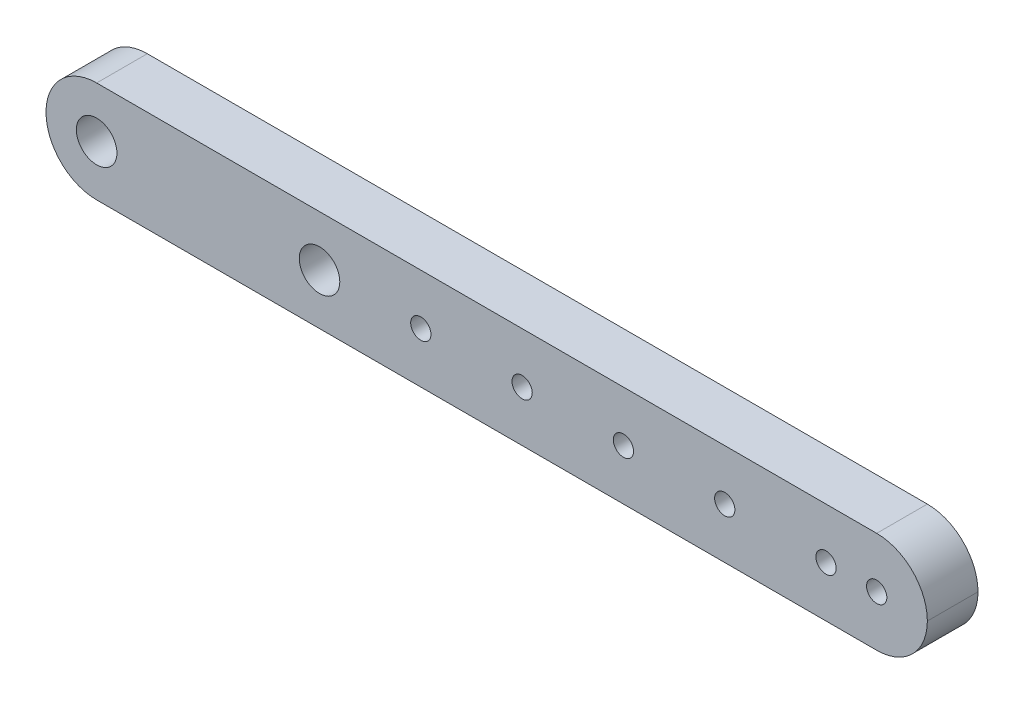
ISO-10303-21;
HEADER;
FILE_DESCRIPTION(('STEP AP214'),'2;1');
FILE_NAME('part.step','',(''),(''),'','','');
FILE_SCHEMA(('AUTOMOTIVE_DESIGN { 1 0 10303 214 1 1 1 1 }'));
ENDSEC;
DATA;
#1=APPLICATION_CONTEXT('core data for automotive mechanical design processes');
#2=APPLICATION_PROTOCOL_DEFINITION('international standard','automotive_design',2000,#1);
#3=PRODUCT_CONTEXT('',#1,'mechanical');
#4=PRODUCT('Part','Part','',(#3));
#5=PRODUCT_RELATED_PRODUCT_CATEGORY('part','',(#4));
#6=PRODUCT_DEFINITION_FORMATION('','',#4);
#7=PRODUCT_DEFINITION_CONTEXT('part definition',#1,'design');
#8=PRODUCT_DEFINITION('design','',#6,#7);
#9=PRODUCT_DEFINITION_SHAPE('','',#8);
#10=(LENGTH_UNIT() NAMED_UNIT(*) SI_UNIT(.MILLI.,.METRE.));
#11=(NAMED_UNIT(*) PLANE_ANGLE_UNIT() SI_UNIT($,.RADIAN.));
#12=(NAMED_UNIT(*) SI_UNIT($,.STERADIAN.) SOLID_ANGLE_UNIT());
#13=UNCERTAINTY_MEASURE_WITH_UNIT(LENGTH_MEASURE(1.E-05),#10,'distance_accuracy_value','');
#14=(GEOMETRIC_REPRESENTATION_CONTEXT(3) GLOBAL_UNCERTAINTY_ASSIGNED_CONTEXT((#13)) GLOBAL_UNIT_ASSIGNED_CONTEXT((#10,
#11,#12)) REPRESENTATION_CONTEXT('',''));
#15=CARTESIAN_POINT('',(0.,0.,0.));
#16=DIRECTION('',(0.,0.,1.));
#17=DIRECTION('',(1.,0.,0.));
#18=AXIS2_PLACEMENT_3D('',#15,#16,#17);
#19=CARTESIAN_POINT('',(0.,0.,10.));
#20=DIRECTION('',(0.,0.,-1.));
#21=DIRECTION('',(-1.,0.,0.));
#22=AXIS2_PLACEMENT_3D('',#19,#20,#21);
#23=PLANE('',#22);
#24=CARTESIAN_POINT('',(10.,9.99999999999999,10.));
#25=DIRECTION('',(0.,0.,-1.));
#26=DIRECTION('',(-1.,0.,0.));
#27=AXIS2_PLACEMENT_3D('',#24,#25,#26);
#28=CIRCLE('',#27,10.);
#29=CARTESIAN_POINT('',(10.,20.,10.));
#30=VERTEX_POINT('',#29);
#31=CARTESIAN_POINT('',(0.,9.99999999999999,10.));
#32=VERTEX_POINT('',#31);
#33=EDGE_CURVE('E64',#30,#32,#28,.F.);
#34=ORIENTED_EDGE('',*,*,#33,.T.);
#35=CARTESIAN_POINT('',(10.,9.99999999999997,10.));
#36=DIRECTION('',(0.,0.,-1.));
#37=DIRECTION('',(-1.,0.,0.));
#38=AXIS2_PLACEMENT_3D('',#35,#36,#37);
#39=CIRCLE('',#38,10.);
#40=CARTESIAN_POINT('',(10.,0.,10.));
#41=VERTEX_POINT('',#40);
#42=EDGE_CURVE('E153',#32,#41,#39,.F.);
#43=ORIENTED_EDGE('',*,*,#42,.T.);
#44=DIRECTION('',(1.,0.,0.));
#45=VECTOR('',#44,1.);
#46=CARTESIAN_POINT('',(0.,0.,10.));
#47=LINE('',#46,#45);
#48=CARTESIAN_POINT('',(164.,0.,10.));
#49=VERTEX_POINT('',#48);
#50=EDGE_CURVE('E114',#41,#49,#47,.T.);
#51=ORIENTED_EDGE('',*,*,#50,.T.);
#52=CARTESIAN_POINT('',(164.,10.,10.));
#53=DIRECTION('',(0.,0.,-1.));
#54=DIRECTION('',(-1.,0.,0.));
#55=AXIS2_PLACEMENT_3D('',#52,#53,#54);
#56=CIRCLE('',#55,10.);
#57=CARTESIAN_POINT('',(174.,10.,10.));
#58=VERTEX_POINT('',#57);
#59=EDGE_CURVE('E57',#49,#58,#56,.F.);
#60=ORIENTED_EDGE('',*,*,#59,.T.);
#61=CARTESIAN_POINT('',(164.,10.,10.));
#62=DIRECTION('',(0.,0.,-1.));
#63=DIRECTION('',(-1.,0.,0.));
#64=AXIS2_PLACEMENT_3D('',#61,#62,#63);
#65=CIRCLE('',#64,10.);
#66=CARTESIAN_POINT('',(164.,20.,10.));
#67=VERTEX_POINT('',#66);
#68=EDGE_CURVE('E104',#58,#67,#65,.F.);
#69=ORIENTED_EDGE('',*,*,#68,.T.);
#70=DIRECTION('',(-1.,0.,0.));
#71=VECTOR('',#70,1.);
#72=CARTESIAN_POINT('',(0.,20.,10.));
#73=LINE('',#72,#71);
#74=EDGE_CURVE('E131',#67,#30,#73,.T.);
#75=ORIENTED_EDGE('',*,*,#74,.T.);
#76=EDGE_LOOP('',(#34,#43,#51,#60,#69,#75));
#77=FACE_BOUND('',#76,.T.);
#78=CARTESIAN_POINT('',(54.,10.,10.));
#79=DIRECTION('',(0.,0.,1.));
#80=DIRECTION('',(1.,0.,0.));
#81=AXIS2_PLACEMENT_3D('',#78,#79,#80);
#82=CIRCLE('',#81,4.00000000000001);
#83=CARTESIAN_POINT('',(58.,10.,10.));
#84=VERTEX_POINT('',#83);
#85=EDGE_CURVE('E125',#84,#84,#82,.T.);
#86=ORIENTED_EDGE('',*,*,#85,.F.);
#87=EDGE_LOOP('',(#86));
#88=FACE_BOUND('',#87,.T.);
#89=CARTESIAN_POINT('',(10.,10.,10.));
#90=DIRECTION('',(0.,0.,1.));
#91=DIRECTION('',(1.,0.,0.));
#92=AXIS2_PLACEMENT_3D('',#89,#90,#91);
#93=CIRCLE('',#92,4.);
#94=CARTESIAN_POINT('',(14.,10.,10.));
#95=VERTEX_POINT('',#94);
#96=EDGE_CURVE('E185',#95,#95,#93,.T.);
#97=ORIENTED_EDGE('',*,*,#96,.F.);
#98=EDGE_LOOP('',(#97));
#99=FACE_BOUND('',#98,.T.);
#100=CARTESIAN_POINT('',(154.,10.,10.));
#101=DIRECTION('',(0.,0.,1.));
#102=DIRECTION('',(1.,0.,0.));
#103=AXIS2_PLACEMENT_3D('',#100,#101,#102);
#104=CIRCLE('',#103,2.);
#105=CARTESIAN_POINT('',(156.,10.,10.));
#106=VERTEX_POINT('',#105);
#107=EDGE_CURVE('E191',#106,#106,#104,.T.);
#108=ORIENTED_EDGE('',*,*,#107,.F.);
#109=EDGE_LOOP('',(#108));
#110=FACE_BOUND('',#109,.T.);
#111=CARTESIAN_POINT('',(164.,10.,10.));
#112=DIRECTION('',(0.,0.,1.));
#113=DIRECTION('',(1.,0.,0.));
#114=AXIS2_PLACEMENT_3D('',#111,#112,#113);
#115=CIRCLE('',#114,1.99999999999997);
#116=CARTESIAN_POINT('',(166.,10.,10.));
#117=VERTEX_POINT('',#116);
#118=EDGE_CURVE('E199',#117,#117,#115,.T.);
#119=ORIENTED_EDGE('',*,*,#118,.F.);
#120=EDGE_LOOP('',(#119));
#121=FACE_BOUND('',#120,.T.);
#122=CARTESIAN_POINT('',(74.,10.,10.));
#123=DIRECTION('',(0.,0.,1.));
#124=DIRECTION('',(1.,0.,0.));
#125=AXIS2_PLACEMENT_3D('',#122,#123,#124);
#126=CIRCLE('',#125,2.);
#127=CARTESIAN_POINT('',(76.,10.,10.));
#128=VERTEX_POINT('',#127);
#129=EDGE_CURVE('E207',#128,#128,#126,.T.);
#130=ORIENTED_EDGE('',*,*,#129,.F.);
#131=EDGE_LOOP('',(#130));
#132=FACE_BOUND('',#131,.T.);
#133=CARTESIAN_POINT('',(114.,10.,10.));
#134=DIRECTION('',(0.,0.,1.));
#135=DIRECTION('',(1.,0.,0.));
#136=AXIS2_PLACEMENT_3D('',#133,#134,#135);
#137=CIRCLE('',#136,2.);
#138=CARTESIAN_POINT('',(116.,10.,10.));
#139=VERTEX_POINT('',#138);
#140=EDGE_CURVE('E215',#139,#139,#137,.T.);
#141=ORIENTED_EDGE('',*,*,#140,.F.);
#142=EDGE_LOOP('',(#141));
#143=FACE_BOUND('',#142,.T.);
#144=CARTESIAN_POINT('',(94.,10.,10.));
#145=DIRECTION('',(0.,0.,1.));
#146=DIRECTION('',(1.,0.,0.));
#147=AXIS2_PLACEMENT_3D('',#144,#145,#146);
#148=CIRCLE('',#147,2.);
#149=CARTESIAN_POINT('',(96.,10.,10.));
#150=VERTEX_POINT('',#149);
#151=EDGE_CURVE('E223',#150,#150,#148,.T.);
#152=ORIENTED_EDGE('',*,*,#151,.F.);
#153=EDGE_LOOP('',(#152));
#154=FACE_BOUND('',#153,.T.);
#155=CARTESIAN_POINT('',(134.,10.,10.));
#156=DIRECTION('',(0.,0.,1.));
#157=DIRECTION('',(1.,0.,0.));
#158=AXIS2_PLACEMENT_3D('',#155,#156,#157);
#159=CIRCLE('',#158,2.);
#160=CARTESIAN_POINT('',(136.,10.,10.));
#161=VERTEX_POINT('',#160);
#162=EDGE_CURVE('E163',#161,#161,#159,.T.);
#163=ORIENTED_EDGE('',*,*,#162,.F.);
#164=EDGE_LOOP('',(#163));
#165=FACE_BOUND('',#164,.T.);
#166=ADVANCED_FACE('F39',(#77,#88,#99,#110,#121,#132,#143,#154,#165),#23,.F.);
#167=CARTESIAN_POINT('',(0.,0.,0.));
#168=DIRECTION('',(0.,0.,-1.));
#169=DIRECTION('',(-1.,0.,0.));
#170=AXIS2_PLACEMENT_3D('',#167,#168,#169);
#171=PLANE('',#170);
#172=CARTESIAN_POINT('',(94.,10.,0.));
#173=DIRECTION('',(0.,0.,1.));
#174=DIRECTION('',(1.,0.,0.));
#175=AXIS2_PLACEMENT_3D('',#172,#173,#174);
#176=CIRCLE('',#175,2.);
#177=CARTESIAN_POINT('',(96.,10.,0.));
#178=VERTEX_POINT('',#177);
#179=EDGE_CURVE('E227',#178,#178,#176,.T.);
#180=ORIENTED_EDGE('',*,*,#179,.T.);
#181=EDGE_LOOP('',(#180));
#182=FACE_BOUND('',#181,.T.);
#183=CARTESIAN_POINT('',(74.,10.,0.));
#184=DIRECTION('',(0.,0.,1.));
#185=DIRECTION('',(1.,0.,0.));
#186=AXIS2_PLACEMENT_3D('',#183,#184,#185);
#187=CIRCLE('',#186,2.);
#188=CARTESIAN_POINT('',(76.,10.,0.));
#189=VERTEX_POINT('',#188);
#190=EDGE_CURVE('E211',#189,#189,#187,.T.);
#191=ORIENTED_EDGE('',*,*,#190,.T.);
#192=EDGE_LOOP('',(#191));
#193=FACE_BOUND('',#192,.T.);
#194=CARTESIAN_POINT('',(154.,10.,0.));
#195=DIRECTION('',(0.,0.,1.));
#196=DIRECTION('',(1.,0.,0.));
#197=AXIS2_PLACEMENT_3D('',#194,#195,#196);
#198=CIRCLE('',#197,2.);
#199=CARTESIAN_POINT('',(156.,10.,0.));
#200=VERTEX_POINT('',#199);
#201=EDGE_CURVE('E195',#200,#200,#198,.T.);
#202=ORIENTED_EDGE('',*,*,#201,.T.);
#203=EDGE_LOOP('',(#202));
#204=FACE_BOUND('',#203,.T.);
#205=CARTESIAN_POINT('',(54.,10.,0.));
#206=DIRECTION('',(0.,0.,1.));
#207=DIRECTION('',(1.,0.,0.));
#208=AXIS2_PLACEMENT_3D('',#205,#206,#207);
#209=CIRCLE('',#208,4.00000000000001);
#210=CARTESIAN_POINT('',(58.,10.,0.));
#211=VERTEX_POINT('',#210);
#212=EDGE_CURVE('E134',#211,#211,#209,.T.);
#213=ORIENTED_EDGE('',*,*,#212,.T.);
#214=EDGE_LOOP('',(#213));
#215=FACE_BOUND('',#214,.T.);
#216=DIRECTION('',(1.,0.,0.));
#217=VECTOR('',#216,1.);
#218=CARTESIAN_POINT('',(174.,0.,0.));
#219=LINE('',#218,#217);
#220=CARTESIAN_POINT('',(10.,0.,0.));
#221=VERTEX_POINT('',#220);
#222=CARTESIAN_POINT('',(164.,0.,0.));
#223=VERTEX_POINT('',#222);
#224=EDGE_CURVE('E112',#221,#223,#219,.T.);
#225=ORIENTED_EDGE('',*,*,#224,.F.);
#226=CARTESIAN_POINT('',(10.,9.99999999999997,0.));
#227=DIRECTION('',(0.,0.,-1.));
#228=DIRECTION('',(-1.,0.,0.));
#229=AXIS2_PLACEMENT_3D('',#226,#227,#228);
#230=CIRCLE('',#229,10.);
#231=CARTESIAN_POINT('',(0.,9.99999999999999,0.));
#232=VERTEX_POINT('',#231);
#233=EDGE_CURVE('E94',#221,#232,#230,.T.);
#234=ORIENTED_EDGE('',*,*,#233,.T.);
#235=CARTESIAN_POINT('',(10.,9.99999999999999,0.));
#236=DIRECTION('',(0.,0.,-1.));
#237=DIRECTION('',(-1.,0.,0.));
#238=AXIS2_PLACEMENT_3D('',#235,#236,#237);
#239=CIRCLE('',#238,10.);
#240=CARTESIAN_POINT('',(10.,20.,0.));
#241=VERTEX_POINT('',#240);
#242=EDGE_CURVE('E105',#232,#241,#239,.T.);
#243=ORIENTED_EDGE('',*,*,#242,.T.);
#244=DIRECTION('',(-1.,0.,0.));
#245=VECTOR('',#244,1.);
#246=CARTESIAN_POINT('',(60.,20.,0.));
#247=LINE('',#246,#245);
#248=CARTESIAN_POINT('',(164.,20.,0.));
#249=VERTEX_POINT('',#248);
#250=EDGE_CURVE('E124',#249,#241,#247,.T.);
#251=ORIENTED_EDGE('',*,*,#250,.F.);
#252=CARTESIAN_POINT('',(164.,10.,0.));
#253=DIRECTION('',(0.,0.,-1.));
#254=DIRECTION('',(-1.,0.,0.));
#255=AXIS2_PLACEMENT_3D('',#252,#253,#254);
#256=CIRCLE('',#255,10.);
#257=CARTESIAN_POINT('',(174.,10.,0.));
#258=VERTEX_POINT('',#257);
#259=EDGE_CURVE('E116',#249,#258,#256,.T.);
#260=ORIENTED_EDGE('',*,*,#259,.T.);
#261=CARTESIAN_POINT('',(164.,10.,0.));
#262=DIRECTION('',(0.,0.,-1.));
#263=DIRECTION('',(-1.,0.,0.));
#264=AXIS2_PLACEMENT_3D('',#261,#262,#263);
#265=CIRCLE('',#264,10.);
#266=EDGE_CURVE('E122',#258,#223,#265,.T.);
#267=ORIENTED_EDGE('',*,*,#266,.T.);
#268=EDGE_LOOP('',(#225,#234,#243,#251,#260,#267));
#269=FACE_BOUND('',#268,.T.);
#270=CARTESIAN_POINT('',(10.,10.,0.));
#271=DIRECTION('',(0.,0.,1.));
#272=DIRECTION('',(1.,0.,0.));
#273=AXIS2_PLACEMENT_3D('',#270,#271,#272);
#274=CIRCLE('',#273,4.);
#275=CARTESIAN_POINT('',(14.,10.,0.));
#276=VERTEX_POINT('',#275);
#277=EDGE_CURVE('E187',#276,#276,#274,.T.);
#278=ORIENTED_EDGE('',*,*,#277,.T.);
#279=EDGE_LOOP('',(#278));
#280=FACE_BOUND('',#279,.T.);
#281=CARTESIAN_POINT('',(164.,10.,0.));
#282=DIRECTION('',(0.,0.,1.));
#283=DIRECTION('',(1.,0.,0.));
#284=AXIS2_PLACEMENT_3D('',#281,#282,#283);
#285=CIRCLE('',#284,1.99999999999997);
#286=CARTESIAN_POINT('',(166.,10.,0.));
#287=VERTEX_POINT('',#286);
#288=EDGE_CURVE('E203',#287,#287,#285,.T.);
#289=ORIENTED_EDGE('',*,*,#288,.T.);
#290=EDGE_LOOP('',(#289));
#291=FACE_BOUND('',#290,.T.);
#292=CARTESIAN_POINT('',(114.,10.,0.));
#293=DIRECTION('',(0.,0.,1.));
#294=DIRECTION('',(1.,0.,0.));
#295=AXIS2_PLACEMENT_3D('',#292,#293,#294);
#296=CIRCLE('',#295,2.);
#297=CARTESIAN_POINT('',(116.,10.,0.));
#298=VERTEX_POINT('',#297);
#299=EDGE_CURVE('E219',#298,#298,#296,.T.);
#300=ORIENTED_EDGE('',*,*,#299,.T.);
#301=EDGE_LOOP('',(#300));
#302=FACE_BOUND('',#301,.T.);
#303=CARTESIAN_POINT('',(134.,10.,0.));
#304=DIRECTION('',(0.,0.,1.));
#305=DIRECTION('',(1.,0.,0.));
#306=AXIS2_PLACEMENT_3D('',#303,#304,#305);
#307=CIRCLE('',#306,2.);
#308=CARTESIAN_POINT('',(136.,10.,0.));
#309=VERTEX_POINT('',#308);
#310=EDGE_CURVE('E158',#309,#309,#307,.T.);
#311=ORIENTED_EDGE('',*,*,#310,.T.);
#312=EDGE_LOOP('',(#311));
#313=FACE_BOUND('',#312,.T.);
#314=ADVANCED_FACE('F119',(#182,#193,#204,#215,#269,#280,#291,#302,#313),#171,.T.);
#315=CARTESIAN_POINT('',(174.,0.,10.));
#316=DIRECTION('',(0.,1.,0.));
#317=DIRECTION('',(-1.,0.,0.));
#318=AXIS2_PLACEMENT_3D('',#315,#316,#317);
#319=PLANE('',#318);
#320=ORIENTED_EDGE('',*,*,#50,.F.);
#321=DIRECTION('',(0.,0.,-1.));
#322=VECTOR('',#321,1.);
#323=CARTESIAN_POINT('',(10.,0.,10.));
#324=LINE('',#323,#322);
#325=EDGE_CURVE('E98',#41,#221,#324,.T.);
#326=ORIENTED_EDGE('',*,*,#325,.T.);
#327=ORIENTED_EDGE('',*,*,#224,.T.);
#328=DIRECTION('',(0.,0.,-1.));
#329=VECTOR('',#328,1.);
#330=CARTESIAN_POINT('',(164.,0.,10.));
#331=LINE('',#330,#329);
#332=EDGE_CURVE('E117',#223,#49,#331,.F.);
#333=ORIENTED_EDGE('',*,*,#332,.T.);
#334=EDGE_LOOP('',(#320,#326,#327,#333));
#335=FACE_BOUND('',#334,.T.);
#336=ADVANCED_FACE('F110',(#335),#319,.F.);
#337=CARTESIAN_POINT('',(60.,20.,10.));
#338=DIRECTION('',(0.,-1.,0.));
#339=DIRECTION('',(1.,0.,0.));
#340=AXIS2_PLACEMENT_3D('',#337,#338,#339);
#341=PLANE('',#340);
#342=ORIENTED_EDGE('',*,*,#250,.T.);
#343=DIRECTION('',(0.,0.,-1.));
#344=VECTOR('',#343,1.);
#345=CARTESIAN_POINT('',(10.,20.,10.));
#346=LINE('',#345,#344);
#347=EDGE_CURVE('E11',#241,#30,#346,.F.);
#348=ORIENTED_EDGE('',*,*,#347,.T.);
#349=ORIENTED_EDGE('',*,*,#74,.F.);
#350=DIRECTION('',(0.,0.,-1.));
#351=VECTOR('',#350,1.);
#352=CARTESIAN_POINT('',(164.,20.,10.));
#353=LINE('',#352,#351);
#354=EDGE_CURVE('E49',#67,#249,#353,.T.);
#355=ORIENTED_EDGE('',*,*,#354,.T.);
#356=EDGE_LOOP('',(#342,#348,#349,#355));
#357=FACE_BOUND('',#356,.T.);
#358=ADVANCED_FACE('F176',(#357),#341,.F.);
#359=CARTESIAN_POINT('',(54.,10.,10.));
#360=DIRECTION('',(0.,0.,-1.));
#361=DIRECTION('',(-1.,0.,0.));
#362=AXIS2_PLACEMENT_3D('',#359,#360,#361);
#363=CYLINDRICAL_SURFACE('',#362,4.00000000000001);
#364=ORIENTED_EDGE('',*,*,#85,.T.);
#365=EDGE_LOOP('',(#364));
#366=FACE_BOUND('',#365,.T.);
#367=ORIENTED_EDGE('',*,*,#212,.F.);
#368=EDGE_LOOP('',(#367));
#369=FACE_BOUND('',#368,.T.);
#370=ADVANCED_FACE('F250',(#366,#369),#363,.F.);
#371=CARTESIAN_POINT('',(10.,10.,10.));
#372=DIRECTION('',(0.,0.,-1.));
#373=DIRECTION('',(-1.,0.,0.));
#374=AXIS2_PLACEMENT_3D('',#371,#372,#373);
#375=CYLINDRICAL_SURFACE('',#374,4.);
#376=ORIENTED_EDGE('',*,*,#96,.T.);
#377=EDGE_LOOP('',(#376));
#378=FACE_BOUND('',#377,.T.);
#379=ORIENTED_EDGE('',*,*,#277,.F.);
#380=EDGE_LOOP('',(#379));
#381=FACE_BOUND('',#380,.T.);
#382=ADVANCED_FACE('F322',(#378,#381),#375,.F.);
#383=CARTESIAN_POINT('',(154.,10.,10.));
#384=DIRECTION('',(0.,0.,-1.));
#385=DIRECTION('',(-1.,0.,0.));
#386=AXIS2_PLACEMENT_3D('',#383,#384,#385);
#387=CYLINDRICAL_SURFACE('',#386,2.);
#388=ORIENTED_EDGE('',*,*,#107,.T.);
#389=EDGE_LOOP('',(#388));
#390=FACE_BOUND('',#389,.T.);
#391=ORIENTED_EDGE('',*,*,#201,.F.);
#392=EDGE_LOOP('',(#391));
#393=FACE_BOUND('',#392,.T.);
#394=ADVANCED_FACE('F314',(#390,#393),#387,.F.);
#395=CARTESIAN_POINT('',(164.,10.,10.));
#396=DIRECTION('',(0.,0.,-1.));
#397=DIRECTION('',(-1.,0.,0.));
#398=AXIS2_PLACEMENT_3D('',#395,#396,#397);
#399=CYLINDRICAL_SURFACE('',#398,1.99999999999997);
#400=ORIENTED_EDGE('',*,*,#118,.T.);
#401=EDGE_LOOP('',(#400));
#402=FACE_BOUND('',#401,.T.);
#403=ORIENTED_EDGE('',*,*,#288,.F.);
#404=EDGE_LOOP('',(#403));
#405=FACE_BOUND('',#404,.T.);
#406=ADVANCED_FACE('F306',(#402,#405),#399,.F.);
#407=CARTESIAN_POINT('',(74.,10.,10.));
#408=DIRECTION('',(0.,0.,-1.));
#409=DIRECTION('',(-1.,0.,0.));
#410=AXIS2_PLACEMENT_3D('',#407,#408,#409);
#411=CYLINDRICAL_SURFACE('',#410,2.);
#412=ORIENTED_EDGE('',*,*,#129,.T.);
#413=EDGE_LOOP('',(#412));
#414=FACE_BOUND('',#413,.T.);
#415=ORIENTED_EDGE('',*,*,#190,.F.);
#416=EDGE_LOOP('',(#415));
#417=FACE_BOUND('',#416,.T.);
#418=ADVANCED_FACE('F298',(#414,#417),#411,.F.);
#419=CARTESIAN_POINT('',(114.,10.,10.));
#420=DIRECTION('',(0.,0.,-1.));
#421=DIRECTION('',(-1.,0.,0.));
#422=AXIS2_PLACEMENT_3D('',#419,#420,#421);
#423=CYLINDRICAL_SURFACE('',#422,2.);
#424=ORIENTED_EDGE('',*,*,#140,.T.);
#425=EDGE_LOOP('',(#424));
#426=FACE_BOUND('',#425,.T.);
#427=ORIENTED_EDGE('',*,*,#299,.F.);
#428=EDGE_LOOP('',(#427));
#429=FACE_BOUND('',#428,.T.);
#430=ADVANCED_FACE('F290',(#426,#429),#423,.F.);
#431=CARTESIAN_POINT('',(94.,10.,10.));
#432=DIRECTION('',(0.,0.,-1.));
#433=DIRECTION('',(-1.,0.,0.));
#434=AXIS2_PLACEMENT_3D('',#431,#432,#433);
#435=CYLINDRICAL_SURFACE('',#434,2.);
#436=ORIENTED_EDGE('',*,*,#151,.T.);
#437=EDGE_LOOP('',(#436));
#438=FACE_BOUND('',#437,.T.);
#439=ORIENTED_EDGE('',*,*,#179,.F.);
#440=EDGE_LOOP('',(#439));
#441=FACE_BOUND('',#440,.T.);
#442=ADVANCED_FACE('F283',(#438,#441),#435,.F.);
#443=CARTESIAN_POINT('',(134.,10.,10.));
#444=DIRECTION('',(0.,0.,-1.));
#445=DIRECTION('',(-1.,0.,0.));
#446=AXIS2_PLACEMENT_3D('',#443,#444,#445);
#447=CYLINDRICAL_SURFACE('',#446,2.);
#448=ORIENTED_EDGE('',*,*,#162,.T.);
#449=EDGE_LOOP('',(#448));
#450=FACE_BOUND('',#449,.T.);
#451=ORIENTED_EDGE('',*,*,#310,.F.);
#452=EDGE_LOOP('',(#451));
#453=FACE_BOUND('',#452,.T.);
#454=ADVANCED_FACE('F239',(#450,#453),#447,.F.);
#455=CARTESIAN_POINT('',(10.,9.99999999999999,10.));
#456=DIRECTION('',(0.,0.,-1.));
#457=DIRECTION('',(-1.,0.,0.));
#458=AXIS2_PLACEMENT_3D('',#455,#456,#457);
#459=CYLINDRICAL_SURFACE('',#458,10.);
#460=DIRECTION('',(0.,0.,-1.));
#461=VECTOR('',#460,1.);
#462=CARTESIAN_POINT('',(0.,9.99999999999999,10.));
#463=LINE('',#462,#461);
#464=EDGE_CURVE('E99',#32,#232,#463,.T.);
#465=ORIENTED_EDGE('',*,*,#464,.F.);
#466=ORIENTED_EDGE('',*,*,#33,.F.);
#467=ORIENTED_EDGE('',*,*,#347,.F.);
#468=ORIENTED_EDGE('',*,*,#242,.F.);
#469=EDGE_LOOP('',(#465,#466,#467,#468));
#470=FACE_BOUND('',#469,.T.);
#471=ADVANCED_FACE('F259',(#470),#459,.T.);
#472=CARTESIAN_POINT('',(10.,9.99999999999997,10.));
#473=DIRECTION('',(0.,0.,-1.));
#474=DIRECTION('',(-1.,0.,0.));
#475=AXIS2_PLACEMENT_3D('',#472,#473,#474);
#476=CYLINDRICAL_SURFACE('',#475,10.);
#477=ORIENTED_EDGE('',*,*,#42,.F.);
#478=ORIENTED_EDGE('',*,*,#464,.T.);
#479=ORIENTED_EDGE('',*,*,#233,.F.);
#480=ORIENTED_EDGE('',*,*,#325,.F.);
#481=EDGE_LOOP('',(#477,#478,#479,#480));
#482=FACE_BOUND('',#481,.T.);
#483=ADVANCED_FACE('F97',(#482),#476,.T.);
#484=CARTESIAN_POINT('',(164.,10.,10.));
#485=DIRECTION('',(0.,0.,-1.));
#486=DIRECTION('',(-1.,0.,0.));
#487=AXIS2_PLACEMENT_3D('',#484,#485,#486);
#488=CYLINDRICAL_SURFACE('',#487,10.);
#489=ORIENTED_EDGE('',*,*,#354,.F.);
#490=ORIENTED_EDGE('',*,*,#68,.F.);
#491=DIRECTION('',(0.,0.,-1.));
#492=VECTOR('',#491,1.);
#493=CARTESIAN_POINT('',(174.,10.,10.));
#494=LINE('',#493,#492);
#495=EDGE_CURVE('E43',#258,#58,#494,.F.);
#496=ORIENTED_EDGE('',*,*,#495,.F.);
#497=ORIENTED_EDGE('',*,*,#259,.F.);
#498=EDGE_LOOP('',(#489,#490,#496,#497));
#499=FACE_BOUND('',#498,.T.);
#500=ADVANCED_FACE('F41',(#499),#488,.T.);
#501=CARTESIAN_POINT('',(164.,10.,10.));
#502=DIRECTION('',(0.,0.,-1.));
#503=DIRECTION('',(-1.,0.,0.));
#504=AXIS2_PLACEMENT_3D('',#501,#502,#503);
#505=CYLINDRICAL_SURFACE('',#504,10.);
#506=ORIENTED_EDGE('',*,*,#59,.F.);
#507=ORIENTED_EDGE('',*,*,#332,.F.);
#508=ORIENTED_EDGE('',*,*,#266,.F.);
#509=ORIENTED_EDGE('',*,*,#495,.T.);
#510=EDGE_LOOP('',(#506,#507,#508,#509));
#511=FACE_BOUND('',#510,.T.);
#512=ADVANCED_FACE('F169',(#511),#505,.T.);
#513=CLOSED_SHELL('',(#166,#314,#336,#358,#370,#382,#394,#406,#418,#430,#442,#454,#471,#483,
#500,#512));
#514=MANIFOLD_SOLID_BREP('B2',#513);
#515=ADVANCED_BREP_SHAPE_REPRESENTATION('',(#18,#514),#14);
#516=SHAPE_DEFINITION_REPRESENTATION(#9,#515);
ENDSEC;
END-ISO-10303-21;
